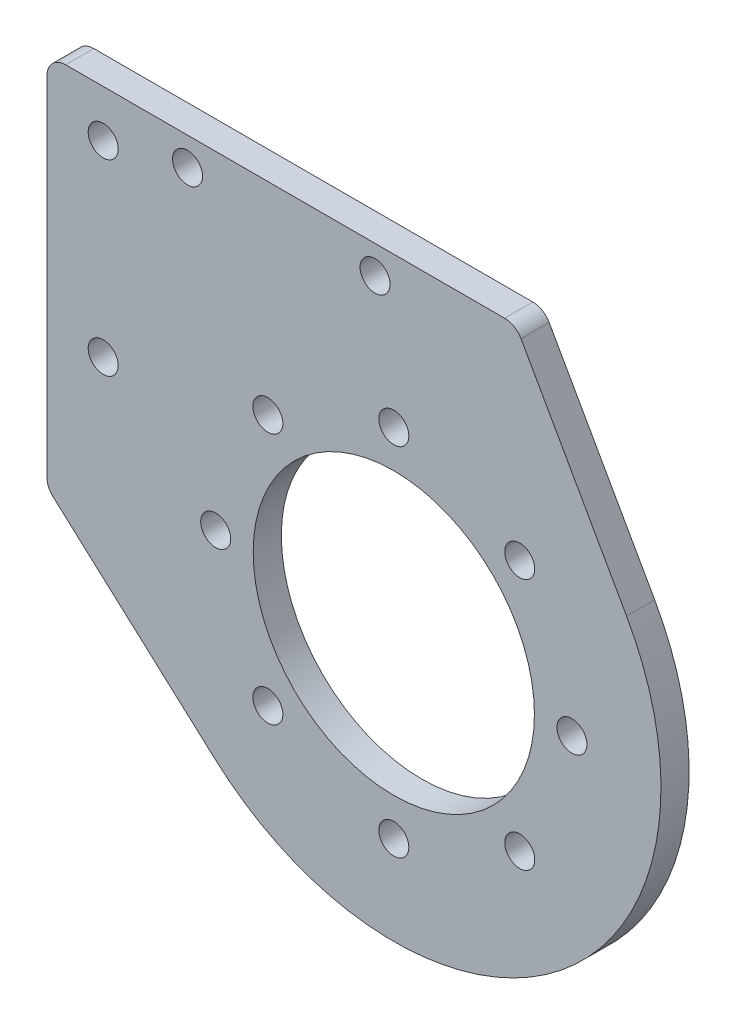
ISO-10303-21;
HEADER;
FILE_DESCRIPTION(('STEP AP214'),'2;1');
FILE_NAME('part.step','',(''),(''),'','','');
FILE_SCHEMA(('AUTOMOTIVE_DESIGN { 1 0 10303 214 1 1 1 1 }'));
ENDSEC;
DATA;
#1=APPLICATION_CONTEXT('core data for automotive mechanical design processes');
#2=APPLICATION_PROTOCOL_DEFINITION('international standard','automotive_design',2000,#1);
#3=PRODUCT_CONTEXT('',#1,'mechanical');
#4=PRODUCT('Part','Part','',(#3));
#5=PRODUCT_RELATED_PRODUCT_CATEGORY('part','',(#4));
#6=PRODUCT_DEFINITION_FORMATION('','',#4);
#7=PRODUCT_DEFINITION_CONTEXT('part definition',#1,'design');
#8=PRODUCT_DEFINITION('design','',#6,#7);
#9=PRODUCT_DEFINITION_SHAPE('','',#8);
#10=(LENGTH_UNIT() NAMED_UNIT(*) SI_UNIT(.MILLI.,.METRE.));
#11=(NAMED_UNIT(*) PLANE_ANGLE_UNIT() SI_UNIT($,.RADIAN.));
#12=(NAMED_UNIT(*) SI_UNIT($,.STERADIAN.) SOLID_ANGLE_UNIT());
#13=UNCERTAINTY_MEASURE_WITH_UNIT(LENGTH_MEASURE(1.E-05),#10,'distance_accuracy_value','');
#14=(GEOMETRIC_REPRESENTATION_CONTEXT(3) GLOBAL_UNCERTAINTY_ASSIGNED_CONTEXT((#13)) GLOBAL_UNIT_ASSIGNED_CONTEXT((#10,
#11,#12)) REPRESENTATION_CONTEXT('',''));
#15=CARTESIAN_POINT('',(0.,0.,0.));
#16=DIRECTION('',(0.,0.,1.));
#17=DIRECTION('',(1.,0.,0.));
#18=AXIS2_PLACEMENT_3D('',#15,#16,#17);
#19=CARTESIAN_POINT('',(0.,0.,3.));
#20=DIRECTION('',(0.,0.,-1.));
#21=DIRECTION('',(-1.,0.,0.));
#22=AXIS2_PLACEMENT_3D('',#19,#20,#21);
#23=CYLINDRICAL_SURFACE('',#22,28.5);
#24=DIRECTION('',(0.,0.,1.));
#25=VECTOR('',#24,1.);
#26=CARTESIAN_POINT('',(24.833892004956,13.9831258267306,-83.5298276579073));
#27=LINE('',#26,#25);
#28=CARTESIAN_POINT('',(24.833892004956,13.9831258267306,0.));
#29=VERTEX_POINT('',#28);
#30=CARTESIAN_POINT('',(24.833892004956,13.9831258267306,3.));
#31=VERTEX_POINT('',#30);
#32=EDGE_CURVE('E110',#29,#31,#27,.T.);
#33=ORIENTED_EDGE('',*,*,#32,.T.);
#34=CARTESIAN_POINT('',(0.,0.,3.));
#35=DIRECTION('',(0.,0.,1.));
#36=DIRECTION('',(1.,0.,0.));
#37=AXIS2_PLACEMENT_3D('',#34,#35,#36);
#38=CIRCLE('',#37,28.5);
#39=CARTESIAN_POINT('',(-19.0934161247275,-21.1587206770162,3.));
#40=VERTEX_POINT('',#39);
#41=EDGE_CURVE('E11',#40,#31,#38,.T.);
#42=ORIENTED_EDGE('',*,*,#41,.F.);
#43=DIRECTION('',(0.,0.,1.));
#44=VECTOR('',#43,1.);
#45=CARTESIAN_POINT('',(-19.0934161247275,-21.1587206770163,-83.5298276579073));
#46=LINE('',#45,#44);
#47=CARTESIAN_POINT('',(-19.0934161247275,-21.1587206770163,0.));
#48=VERTEX_POINT('',#47);
#49=EDGE_CURVE('E143',#48,#40,#46,.T.);
#50=ORIENTED_EDGE('',*,*,#49,.F.);
#51=CARTESIAN_POINT('',(0.,0.,0.));
#52=DIRECTION('',(0.,0.,1.));
#53=DIRECTION('',(1.,0.,0.));
#54=AXIS2_PLACEMENT_3D('',#51,#52,#53);
#55=CIRCLE('',#54,28.5);
#56=EDGE_CURVE('E42',#48,#29,#55,.T.);
#57=ORIENTED_EDGE('',*,*,#56,.T.);
#58=EDGE_LOOP('',(#33,#42,#50,#57));
#59=FACE_BOUND('',#58,.T.);
#60=ADVANCED_FACE('F39',(#59),#23,.T.);
#61=CARTESIAN_POINT('',(0.,0.,3.));
#62=DIRECTION('',(0.,0.,1.));
#63=DIRECTION('',(1.,0.,0.));
#64=AXIS2_PLACEMENT_3D('',#61,#62,#63);
#65=PLANE('',#64);
#66=CARTESIAN_POINT('',(-19.,1.96176408451265E-13,3.));
#67=DIRECTION('',(0.,0.,1.));
#68=DIRECTION('',(1.,0.,0.));
#69=AXIS2_PLACEMENT_3D('',#66,#67,#68);
#70=CIRCLE('',#69,1.6);
#71=CARTESIAN_POINT('',(-17.4,1.96176408451265E-13,3.));
#72=VERTEX_POINT('',#71);
#73=EDGE_CURVE('E169',#72,#72,#70,.T.);
#74=ORIENTED_EDGE('',*,*,#73,.F.);
#75=EDGE_LOOP('',(#74));
#76=FACE_BOUND('',#75,.T.);
#77=CARTESIAN_POINT('',(-1.30784272300843E-13,-19.,3.));
#78=DIRECTION('',(0.,0.,1.));
#79=DIRECTION('',(1.,0.,0.));
#80=AXIS2_PLACEMENT_3D('',#77,#78,#79);
#81=CIRCLE('',#80,1.6);
#82=CARTESIAN_POINT('',(1.59999999999987,-19.,3.));
#83=VERTEX_POINT('',#82);
#84=EDGE_CURVE('E181',#83,#83,#81,.T.);
#85=ORIENTED_EDGE('',*,*,#84,.F.);
#86=EDGE_LOOP('',(#85));
#87=FACE_BOUND('',#86,.T.);
#88=CARTESIAN_POINT('',(19.,-3.30686302041412E-13,3.));
#89=DIRECTION('',(0.,0.,1.));
#90=DIRECTION('',(1.,0.,0.));
#91=AXIS2_PLACEMENT_3D('',#88,#89,#90);
#92=CIRCLE('',#91,1.6);
#93=CARTESIAN_POINT('',(20.6,-3.30686302041412E-13,3.));
#94=VERTEX_POINT('',#93);
#95=EDGE_CURVE('E193',#94,#94,#92,.T.);
#96=ORIENTED_EDGE('',*,*,#95,.F.);
#97=EDGE_LOOP('',(#96));
#98=FACE_BOUND('',#97,.T.);
#99=CARTESIAN_POINT('',(0.,19.,3.));
#100=DIRECTION('',(0.,0.,1.));
#101=DIRECTION('',(1.,0.,0.));
#102=AXIS2_PLACEMENT_3D('',#99,#100,#101);
#103=CIRCLE('',#102,1.6);
#104=CARTESIAN_POINT('',(1.6,19.,3.));
#105=VERTEX_POINT('',#104);
#106=EDGE_CURVE('E205',#105,#105,#103,.T.);
#107=ORIENTED_EDGE('',*,*,#106,.F.);
#108=EDGE_LOOP('',(#107));
#109=FACE_BOUND('',#108,.T.);
#110=ORIENTED_EDGE('',*,*,#41,.T.);
#111=DIRECTION('',(-0.490635993920373,0.871364631752843,0.));
#112=VECTOR('',#111,1.);
#113=CARTESIAN_POINT('',(13.5736113362495,33.9812719878407,3.));
#114=LINE('',#113,#112);
#115=CARTESIAN_POINT('',(13.5736113362495,33.9812719878407,3.));
#116=VERTEX_POINT('',#115);
#117=EDGE_CURVE('E105',#31,#116,#114,.T.);
#118=ORIENTED_EDGE('',*,*,#117,.T.);
#119=CARTESIAN_POINT('',(11.8308820727438,33.,3.));
#120=DIRECTION('',(0.,0.,1.));
#121=DIRECTION('',(-1.,0.,0.));
#122=AXIS2_PLACEMENT_3D('',#119,#120,#121);
#123=CIRCLE('',#122,2.);
#124=CARTESIAN_POINT('',(11.8308820727438,35.,3.));
#125=VERTEX_POINT('',#124);
#126=EDGE_CURVE('E113',#116,#125,#123,.T.);
#127=ORIENTED_EDGE('',*,*,#126,.T.);
#128=DIRECTION('',(-1.,0.,0.));
#129=VECTOR('',#128,1.);
#130=CARTESIAN_POINT('',(-35.,35.,3.));
#131=LINE('',#130,#129);
#132=CARTESIAN_POINT('',(-35.,35.,3.));
#133=VERTEX_POINT('',#132);
#134=EDGE_CURVE('E119',#125,#133,#131,.T.);
#135=ORIENTED_EDGE('',*,*,#134,.T.);
#136=CARTESIAN_POINT('',(-35.,33.,3.));
#137=DIRECTION('',(0.,0.,1.));
#138=DIRECTION('',(-1.,0.,0.));
#139=AXIS2_PLACEMENT_3D('',#136,#137,#138);
#140=CIRCLE('',#139,2.);
#141=CARTESIAN_POINT('',(-37.,33.,3.));
#142=VERTEX_POINT('',#141);
#143=EDGE_CURVE('E132',#133,#142,#140,.T.);
#144=ORIENTED_EDGE('',*,*,#143,.T.);
#145=DIRECTION('',(0.,-1.,0.));
#146=VECTOR('',#145,1.);
#147=CARTESIAN_POINT('',(-37.,-4.11085513922489,3.));
#148=LINE('',#147,#146);
#149=CARTESIAN_POINT('',(-37.,-4.1108551392249,3.));
#150=VERTEX_POINT('',#149);
#151=EDGE_CURVE('E135',#142,#150,#148,.T.);
#152=ORIENTED_EDGE('',*,*,#151,.T.);
#153=CARTESIAN_POINT('',(-35.,-4.1108551392249,3.));
#154=DIRECTION('',(0.,0.,1.));
#155=DIRECTION('',(-1.,0.,0.));
#156=AXIS2_PLACEMENT_3D('',#153,#154,#155);
#157=CIRCLE('',#156,2.);
#158=CARTESIAN_POINT('',(-36.3398888508581,-5.59567764287517,3.));
#159=VERTEX_POINT('',#158);
#160=EDGE_CURVE('E138',#150,#159,#157,.T.);
#161=ORIENTED_EDGE('',*,*,#160,.T.);
#162=DIRECTION('',(0.742411251825131,-0.669944425429036,0.));
#163=VECTOR('',#162,1.);
#164=CARTESIAN_POINT('',(-36.3398888508581,-5.59567764287517,3.));
#165=LINE('',#164,#163);
#166=EDGE_CURVE('E141',#159,#40,#165,.T.);
#167=ORIENTED_EDGE('',*,*,#166,.T.);
#168=EDGE_LOOP('',(#110,#118,#127,#135,#144,#152,#161,#167));
#169=FACE_BOUND('',#168,.T.);
#170=CARTESIAN_POINT('',(0.,0.,3.));
#171=DIRECTION('',(0.,0.,1.));
#172=DIRECTION('',(1.,0.,0.));
#173=AXIS2_PLACEMENT_3D('',#170,#171,#172);
#174=CIRCLE('',#173,15.);
#175=CARTESIAN_POINT('',(15.,0.,3.));
#176=VERTEX_POINT('',#175);
#177=EDGE_CURVE('E211',#176,#176,#174,.T.);
#178=ORIENTED_EDGE('',*,*,#177,.F.);
#179=EDGE_LOOP('',(#178));
#180=FACE_BOUND('',#179,.T.);
#181=CARTESIAN_POINT('',(13.4350288425446,13.4350288425442,3.));
#182=DIRECTION('',(0.,0.,1.));
#183=DIRECTION('',(1.,0.,0.));
#184=AXIS2_PLACEMENT_3D('',#181,#182,#183);
#185=CIRCLE('',#184,1.6);
#186=CARTESIAN_POINT('',(15.0350288425446,13.4350288425442,3.));
#187=VERTEX_POINT('',#186);
#188=EDGE_CURVE('E199',#187,#187,#185,.T.);
#189=ORIENTED_EDGE('',*,*,#188,.F.);
#190=EDGE_LOOP('',(#189));
#191=FACE_BOUND('',#190,.T.);
#192=CARTESIAN_POINT('',(13.4350288425443,-13.4350288425445,3.));
#193=DIRECTION('',(0.,0.,1.));
#194=DIRECTION('',(1.,0.,0.));
#195=AXIS2_PLACEMENT_3D('',#192,#193,#194);
#196=CIRCLE('',#195,1.6);
#197=CARTESIAN_POINT('',(15.0350288425443,-13.4350288425445,3.));
#198=VERTEX_POINT('',#197);
#199=EDGE_CURVE('E187',#198,#198,#196,.T.);
#200=ORIENTED_EDGE('',*,*,#199,.F.);
#201=EDGE_LOOP('',(#200));
#202=FACE_BOUND('',#201,.T.);
#203=CARTESIAN_POINT('',(-13.4350288425445,-13.4350288425443,3.));
#204=DIRECTION('',(0.,0.,1.));
#205=DIRECTION('',(1.,0.,0.));
#206=AXIS2_PLACEMENT_3D('',#203,#204,#205);
#207=CIRCLE('',#206,1.6);
#208=CARTESIAN_POINT('',(-11.8350288425445,-13.4350288425443,3.));
#209=VERTEX_POINT('',#208);
#210=EDGE_CURVE('E175',#209,#209,#207,.T.);
#211=ORIENTED_EDGE('',*,*,#210,.F.);
#212=EDGE_LOOP('',(#211));
#213=FACE_BOUND('',#212,.T.);
#214=CARTESIAN_POINT('',(-13.4350288425442,13.4350288425446,3.));
#215=DIRECTION('',(0.,0.,1.));
#216=DIRECTION('',(1.,0.,0.));
#217=AXIS2_PLACEMENT_3D('',#214,#215,#216);
#218=CIRCLE('',#217,1.6);
#219=CARTESIAN_POINT('',(-11.8350288425442,13.4350288425446,3.));
#220=VERTEX_POINT('',#219);
#221=EDGE_CURVE('E161',#220,#220,#218,.T.);
#222=ORIENTED_EDGE('',*,*,#221,.F.);
#223=EDGE_LOOP('',(#222));
#224=FACE_BOUND('',#223,.T.);
#225=CARTESIAN_POINT('',(-2.,32.,3.));
#226=DIRECTION('',(0.,0.,1.));
#227=DIRECTION('',(1.,0.,0.));
#228=AXIS2_PLACEMENT_3D('',#225,#226,#227);
#229=CIRCLE('',#228,1.6);
#230=CARTESIAN_POINT('',(-0.400000000000003,32.,3.));
#231=VERTEX_POINT('',#230);
#232=EDGE_CURVE('E293',#231,#231,#229,.T.);
#233=ORIENTED_EDGE('',*,*,#232,.F.);
#234=EDGE_LOOP('',(#233));
#235=FACE_BOUND('',#234,.T.);
#236=CARTESIAN_POINT('',(-22.,32.,3.));
#237=DIRECTION('',(0.,0.,1.));
#238=DIRECTION('',(1.,0.,0.));
#239=AXIS2_PLACEMENT_3D('',#236,#237,#238);
#240=CIRCLE('',#239,1.6);
#241=CARTESIAN_POINT('',(-20.4,32.,3.));
#242=VERTEX_POINT('',#241);
#243=EDGE_CURVE('E296',#242,#242,#240,.T.);
#244=ORIENTED_EDGE('',*,*,#243,.F.);
#245=EDGE_LOOP('',(#244));
#246=FACE_BOUND('',#245,.T.);
#247=CARTESIAN_POINT('',(-31.,10.,3.));
#248=DIRECTION('',(0.,0.,1.));
#249=DIRECTION('',(1.,0.,0.));
#250=AXIS2_PLACEMENT_3D('',#247,#248,#249);
#251=CIRCLE('',#250,1.6);
#252=CARTESIAN_POINT('',(-29.4,10.,3.));
#253=VERTEX_POINT('',#252);
#254=EDGE_CURVE('E127',#253,#253,#251,.T.);
#255=ORIENTED_EDGE('',*,*,#254,.F.);
#256=EDGE_LOOP('',(#255));
#257=FACE_BOUND('',#256,.T.);
#258=CARTESIAN_POINT('',(-31.,30.,3.));
#259=DIRECTION('',(0.,0.,1.));
#260=DIRECTION('',(1.,0.,0.));
#261=AXIS2_PLACEMENT_3D('',#258,#259,#260);
#262=CIRCLE('',#261,1.6);
#263=CARTESIAN_POINT('',(-29.4,30.,3.));
#264=VERTEX_POINT('',#263);
#265=EDGE_CURVE('E124',#264,#264,#262,.T.);
#266=ORIENTED_EDGE('',*,*,#265,.F.);
#267=EDGE_LOOP('',(#266));
#268=FACE_BOUND('',#267,.T.);
#269=ADVANCED_FACE('F121',(#76,#87,#98,#109,#169,#180,#191,#202,#213,#224,#235,#246,#257,#268),
#65,.T.);
#270=CARTESIAN_POINT('',(0.,0.,0.));
#271=DIRECTION('',(0.,0.,1.));
#272=DIRECTION('',(1.,0.,0.));
#273=AXIS2_PLACEMENT_3D('',#270,#271,#272);
#274=PLANE('',#273);
#275=ORIENTED_EDGE('',*,*,#56,.F.);
#276=DIRECTION('',(-0.742411251825131,0.669944425429036,0.));
#277=VECTOR('',#276,1.);
#278=CARTESIAN_POINT('',(-36.3398888508581,-5.59567764287517,0.));
#279=LINE('',#278,#277);
#280=CARTESIAN_POINT('',(-36.3398888508581,-5.59567764287517,0.));
#281=VERTEX_POINT('',#280);
#282=EDGE_CURVE('E282',#48,#281,#279,.T.);
#283=ORIENTED_EDGE('',*,*,#282,.T.);
#284=CARTESIAN_POINT('',(-35.,-4.1108551392249,0.));
#285=DIRECTION('',(0.,0.,1.));
#286=DIRECTION('',(1.,0.,0.));
#287=AXIS2_PLACEMENT_3D('',#284,#285,#286);
#288=CIRCLE('',#287,2.);
#289=CARTESIAN_POINT('',(-37.,-4.1108551392249,0.));
#290=VERTEX_POINT('',#289);
#291=EDGE_CURVE('E290',#281,#290,#288,.F.);
#292=ORIENTED_EDGE('',*,*,#291,.T.);
#293=DIRECTION('',(0.,1.,0.));
#294=VECTOR('',#293,1.);
#295=CARTESIAN_POINT('',(-37.,-4.11085513922489,0.));
#296=LINE('',#295,#294);
#297=CARTESIAN_POINT('',(-37.,33.,0.));
#298=VERTEX_POINT('',#297);
#299=EDGE_CURVE('E288',#290,#298,#296,.T.);
#300=ORIENTED_EDGE('',*,*,#299,.T.);
#301=CARTESIAN_POINT('',(-35.,33.,0.));
#302=DIRECTION('',(0.,0.,1.));
#303=DIRECTION('',(1.,0.,0.));
#304=AXIS2_PLACEMENT_3D('',#301,#302,#303);
#305=CIRCLE('',#304,2.);
#306=CARTESIAN_POINT('',(-35.,35.,0.));
#307=VERTEX_POINT('',#306);
#308=EDGE_CURVE('E286',#298,#307,#305,.F.);
#309=ORIENTED_EDGE('',*,*,#308,.T.);
#310=DIRECTION('',(1.,0.,0.));
#311=VECTOR('',#310,1.);
#312=CARTESIAN_POINT('',(-35.,35.,0.));
#313=LINE('',#312,#311);
#314=CARTESIAN_POINT('',(11.8308820727438,35.,0.));
#315=VERTEX_POINT('',#314);
#316=EDGE_CURVE('E284',#307,#315,#313,.T.);
#317=ORIENTED_EDGE('',*,*,#316,.T.);
#318=CARTESIAN_POINT('',(11.8308820727438,33.,0.));
#319=DIRECTION('',(0.,0.,1.));
#320=DIRECTION('',(1.,0.,0.));
#321=AXIS2_PLACEMENT_3D('',#318,#319,#320);
#322=CIRCLE('',#321,2.);
#323=CARTESIAN_POINT('',(13.5736113362495,33.9812719878407,0.));
#324=VERTEX_POINT('',#323);
#325=EDGE_CURVE('E145',#315,#324,#322,.F.);
#326=ORIENTED_EDGE('',*,*,#325,.T.);
#327=DIRECTION('',(0.490635993920373,-0.871364631752843,0.));
#328=VECTOR('',#327,1.);
#329=CARTESIAN_POINT('',(13.5736113362495,33.9812719878407,0.));
#330=LINE('',#329,#328);
#331=EDGE_CURVE('E106',#324,#29,#330,.T.);
#332=ORIENTED_EDGE('',*,*,#331,.T.);
#333=EDGE_LOOP('',(#275,#283,#292,#300,#309,#317,#326,#332));
#334=FACE_BOUND('',#333,.T.);
#335=CARTESIAN_POINT('',(0.,0.,0.));
#336=DIRECTION('',(0.,0.,1.));
#337=DIRECTION('',(1.,0.,0.));
#338=AXIS2_PLACEMENT_3D('',#335,#336,#337);
#339=CIRCLE('',#338,15.);
#340=CARTESIAN_POINT('',(15.,0.,0.));
#341=VERTEX_POINT('',#340);
#342=EDGE_CURVE('E208',#341,#341,#339,.T.);
#343=ORIENTED_EDGE('',*,*,#342,.T.);
#344=EDGE_LOOP('',(#343));
#345=FACE_BOUND('',#344,.T.);
#346=CARTESIAN_POINT('',(0.,19.,0.));
#347=DIRECTION('',(0.,0.,1.));
#348=DIRECTION('',(1.,0.,0.));
#349=AXIS2_PLACEMENT_3D('',#346,#347,#348);
#350=CIRCLE('',#349,1.6);
#351=CARTESIAN_POINT('',(1.6,19.,0.));
#352=VERTEX_POINT('',#351);
#353=EDGE_CURVE('E202',#352,#352,#350,.T.);
#354=ORIENTED_EDGE('',*,*,#353,.T.);
#355=EDGE_LOOP('',(#354));
#356=FACE_BOUND('',#355,.T.);
#357=CARTESIAN_POINT('',(13.4350288425446,13.4350288425442,0.));
#358=DIRECTION('',(0.,0.,1.));
#359=DIRECTION('',(1.,0.,0.));
#360=AXIS2_PLACEMENT_3D('',#357,#358,#359);
#361=CIRCLE('',#360,1.6);
#362=CARTESIAN_POINT('',(15.0350288425446,13.4350288425442,0.));
#363=VERTEX_POINT('',#362);
#364=EDGE_CURVE('E196',#363,#363,#361,.T.);
#365=ORIENTED_EDGE('',*,*,#364,.T.);
#366=EDGE_LOOP('',(#365));
#367=FACE_BOUND('',#366,.T.);
#368=CARTESIAN_POINT('',(19.,-3.30686302041412E-13,0.));
#369=DIRECTION('',(0.,0.,1.));
#370=DIRECTION('',(1.,0.,0.));
#371=AXIS2_PLACEMENT_3D('',#368,#369,#370);
#372=CIRCLE('',#371,1.6);
#373=CARTESIAN_POINT('',(20.6,-3.30686302041412E-13,0.));
#374=VERTEX_POINT('',#373);
#375=EDGE_CURVE('E190',#374,#374,#372,.T.);
#376=ORIENTED_EDGE('',*,*,#375,.T.);
#377=EDGE_LOOP('',(#376));
#378=FACE_BOUND('',#377,.T.);
#379=CARTESIAN_POINT('',(13.4350288425443,-13.4350288425445,0.));
#380=DIRECTION('',(0.,0.,1.));
#381=DIRECTION('',(1.,0.,0.));
#382=AXIS2_PLACEMENT_3D('',#379,#380,#381);
#383=CIRCLE('',#382,1.6);
#384=CARTESIAN_POINT('',(15.0350288425443,-13.4350288425445,0.));
#385=VERTEX_POINT('',#384);
#386=EDGE_CURVE('E184',#385,#385,#383,.T.);
#387=ORIENTED_EDGE('',*,*,#386,.T.);
#388=EDGE_LOOP('',(#387));
#389=FACE_BOUND('',#388,.T.);
#390=CARTESIAN_POINT('',(-1.30784272300843E-13,-19.,0.));
#391=DIRECTION('',(0.,0.,1.));
#392=DIRECTION('',(1.,0.,0.));
#393=AXIS2_PLACEMENT_3D('',#390,#391,#392);
#394=CIRCLE('',#393,1.6);
#395=CARTESIAN_POINT('',(1.59999999999987,-19.,0.));
#396=VERTEX_POINT('',#395);
#397=EDGE_CURVE('E178',#396,#396,#394,.T.);
#398=ORIENTED_EDGE('',*,*,#397,.T.);
#399=EDGE_LOOP('',(#398));
#400=FACE_BOUND('',#399,.T.);
#401=CARTESIAN_POINT('',(-13.4350288425445,-13.4350288425443,0.));
#402=DIRECTION('',(0.,0.,1.));
#403=DIRECTION('',(1.,0.,0.));
#404=AXIS2_PLACEMENT_3D('',#401,#402,#403);
#405=CIRCLE('',#404,1.6);
#406=CARTESIAN_POINT('',(-11.8350288425445,-13.4350288425443,0.));
#407=VERTEX_POINT('',#406);
#408=EDGE_CURVE('E172',#407,#407,#405,.T.);
#409=ORIENTED_EDGE('',*,*,#408,.T.);
#410=EDGE_LOOP('',(#409));
#411=FACE_BOUND('',#410,.T.);
#412=CARTESIAN_POINT('',(-19.,1.96176408451265E-13,0.));
#413=DIRECTION('',(0.,0.,1.));
#414=DIRECTION('',(1.,0.,0.));
#415=AXIS2_PLACEMENT_3D('',#412,#413,#414);
#416=CIRCLE('',#415,1.6);
#417=CARTESIAN_POINT('',(-17.4,1.96176408451265E-13,0.));
#418=VERTEX_POINT('',#417);
#419=EDGE_CURVE('E164',#418,#418,#416,.T.);
#420=ORIENTED_EDGE('',*,*,#419,.T.);
#421=EDGE_LOOP('',(#420));
#422=FACE_BOUND('',#421,.T.);
#423=CARTESIAN_POINT('',(-13.4350288425442,13.4350288425446,0.));
#424=DIRECTION('',(0.,0.,1.));
#425=DIRECTION('',(1.,0.,0.));
#426=AXIS2_PLACEMENT_3D('',#423,#424,#425);
#427=CIRCLE('',#426,1.6);
#428=CARTESIAN_POINT('',(-11.8350288425442,13.4350288425446,0.));
#429=VERTEX_POINT('',#428);
#430=EDGE_CURVE('E165',#429,#429,#427,.T.);
#431=ORIENTED_EDGE('',*,*,#430,.T.);
#432=EDGE_LOOP('',(#431));
#433=FACE_BOUND('',#432,.T.);
#434=CARTESIAN_POINT('',(-31.,10.,0.));
#435=DIRECTION('',(0.,0.,1.));
#436=DIRECTION('',(1.,0.,0.));
#437=AXIS2_PLACEMENT_3D('',#434,#435,#436);
#438=CIRCLE('',#437,1.6);
#439=CARTESIAN_POINT('',(-29.4,10.,0.));
#440=VERTEX_POINT('',#439);
#441=EDGE_CURVE('E160',#440,#440,#438,.F.);
#442=ORIENTED_EDGE('',*,*,#441,.F.);
#443=EDGE_LOOP('',(#442));
#444=FACE_BOUND('',#443,.T.);
#445=CARTESIAN_POINT('',(-2.,32.,0.));
#446=DIRECTION('',(0.,0.,1.));
#447=DIRECTION('',(1.,0.,0.));
#448=AXIS2_PLACEMENT_3D('',#445,#446,#447);
#449=CIRCLE('',#448,1.6);
#450=CARTESIAN_POINT('',(-0.400000000000003,32.,0.));
#451=VERTEX_POINT('',#450);
#452=EDGE_CURVE('E156',#451,#451,#449,.F.);
#453=ORIENTED_EDGE('',*,*,#452,.F.);
#454=EDGE_LOOP('',(#453));
#455=FACE_BOUND('',#454,.T.);
#456=CARTESIAN_POINT('',(-22.,32.,0.));
#457=DIRECTION('',(0.,0.,1.));
#458=DIRECTION('',(1.,0.,0.));
#459=AXIS2_PLACEMENT_3D('',#456,#457,#458);
#460=CIRCLE('',#459,1.6);
#461=CARTESIAN_POINT('',(-20.4,32.,0.));
#462=VERTEX_POINT('',#461);
#463=EDGE_CURVE('E159',#462,#462,#460,.F.);
#464=ORIENTED_EDGE('',*,*,#463,.F.);
#465=EDGE_LOOP('',(#464));
#466=FACE_BOUND('',#465,.T.);
#467=CARTESIAN_POINT('',(-31.,30.,0.));
#468=DIRECTION('',(0.,0.,1.));
#469=DIRECTION('',(1.,0.,0.));
#470=AXIS2_PLACEMENT_3D('',#467,#468,#469);
#471=CIRCLE('',#470,1.6);
#472=CARTESIAN_POINT('',(-29.4,30.,0.));
#473=VERTEX_POINT('',#472);
#474=EDGE_CURVE('E168',#473,#473,#471,.F.);
#475=ORIENTED_EDGE('',*,*,#474,.F.);
#476=EDGE_LOOP('',(#475));
#477=FACE_BOUND('',#476,.T.);
#478=ADVANCED_FACE('F217',(#334,#345,#356,#367,#378,#389,#400,#411,#422,#433,#444,#455,#466,
#477),#274,.F.);
#479=CARTESIAN_POINT('',(0.,0.,3.));
#480=DIRECTION('',(0.,0.,-1.));
#481=DIRECTION('',(-1.,0.,0.));
#482=AXIS2_PLACEMENT_3D('',#479,#480,#481);
#483=CYLINDRICAL_SURFACE('',#482,15.);
#484=ORIENTED_EDGE('',*,*,#177,.T.);
#485=EDGE_LOOP('',(#484));
#486=FACE_BOUND('',#485,.T.);
#487=ORIENTED_EDGE('',*,*,#342,.F.);
#488=EDGE_LOOP('',(#487));
#489=FACE_BOUND('',#488,.T.);
#490=ADVANCED_FACE('F220',(#486,#489),#483,.F.);
#491=CARTESIAN_POINT('',(0.,19.,3.));
#492=DIRECTION('',(0.,0.,-1.));
#493=DIRECTION('',(-1.,0.,0.));
#494=AXIS2_PLACEMENT_3D('',#491,#492,#493);
#495=CYLINDRICAL_SURFACE('',#494,1.6);
#496=ORIENTED_EDGE('',*,*,#106,.T.);
#497=EDGE_LOOP('',(#496));
#498=FACE_BOUND('',#497,.T.);
#499=ORIENTED_EDGE('',*,*,#353,.F.);
#500=EDGE_LOOP('',(#499));
#501=FACE_BOUND('',#500,.T.);
#502=ADVANCED_FACE('F222',(#498,#501),#495,.F.);
#503=CARTESIAN_POINT('',(13.4350288425446,13.4350288425442,3.));
#504=DIRECTION('',(0.,0.,-1.));
#505=DIRECTION('',(-1.,0.,0.));
#506=AXIS2_PLACEMENT_3D('',#503,#504,#505);
#507=CYLINDRICAL_SURFACE('',#506,1.6);
#508=ORIENTED_EDGE('',*,*,#188,.T.);
#509=EDGE_LOOP('',(#508));
#510=FACE_BOUND('',#509,.T.);
#511=ORIENTED_EDGE('',*,*,#364,.F.);
#512=EDGE_LOOP('',(#511));
#513=FACE_BOUND('',#512,.T.);
#514=ADVANCED_FACE('F228',(#510,#513),#507,.F.);
#515=CARTESIAN_POINT('',(19.,-3.30686302041412E-13,3.));
#516=DIRECTION('',(0.,0.,-1.));
#517=DIRECTION('',(-1.,0.,0.));
#518=AXIS2_PLACEMENT_3D('',#515,#516,#517);
#519=CYLINDRICAL_SURFACE('',#518,1.6);
#520=ORIENTED_EDGE('',*,*,#95,.T.);
#521=EDGE_LOOP('',(#520));
#522=FACE_BOUND('',#521,.T.);
#523=ORIENTED_EDGE('',*,*,#375,.F.);
#524=EDGE_LOOP('',(#523));
#525=FACE_BOUND('',#524,.T.);
#526=ADVANCED_FACE('F359',(#522,#525),#519,.F.);
#527=CARTESIAN_POINT('',(13.4350288425443,-13.4350288425445,3.));
#528=DIRECTION('',(0.,0.,-1.));
#529=DIRECTION('',(-1.,0.,0.));
#530=AXIS2_PLACEMENT_3D('',#527,#528,#529);
#531=CYLINDRICAL_SURFACE('',#530,1.6);
#532=ORIENTED_EDGE('',*,*,#199,.T.);
#533=EDGE_LOOP('',(#532));
#534=FACE_BOUND('',#533,.T.);
#535=ORIENTED_EDGE('',*,*,#386,.F.);
#536=EDGE_LOOP('',(#535));
#537=FACE_BOUND('',#536,.T.);
#538=ADVANCED_FACE('F355',(#534,#537),#531,.F.);
#539=CARTESIAN_POINT('',(-1.30784272300843E-13,-19.,3.));
#540=DIRECTION('',(0.,0.,-1.));
#541=DIRECTION('',(-1.,0.,0.));
#542=AXIS2_PLACEMENT_3D('',#539,#540,#541);
#543=CYLINDRICAL_SURFACE('',#542,1.6);
#544=ORIENTED_EDGE('',*,*,#84,.T.);
#545=EDGE_LOOP('',(#544));
#546=FACE_BOUND('',#545,.T.);
#547=ORIENTED_EDGE('',*,*,#397,.F.);
#548=EDGE_LOOP('',(#547));
#549=FACE_BOUND('',#548,.T.);
#550=ADVANCED_FACE('F351',(#546,#549),#543,.F.);
#551=CARTESIAN_POINT('',(-13.4350288425445,-13.4350288425443,3.));
#552=DIRECTION('',(0.,0.,-1.));
#553=DIRECTION('',(-1.,0.,0.));
#554=AXIS2_PLACEMENT_3D('',#551,#552,#553);
#555=CYLINDRICAL_SURFACE('',#554,1.6);
#556=ORIENTED_EDGE('',*,*,#210,.T.);
#557=EDGE_LOOP('',(#556));
#558=FACE_BOUND('',#557,.T.);
#559=ORIENTED_EDGE('',*,*,#408,.F.);
#560=EDGE_LOOP('',(#559));
#561=FACE_BOUND('',#560,.T.);
#562=ADVANCED_FACE('F347',(#558,#561),#555,.F.);
#563=CARTESIAN_POINT('',(-19.,1.96176408451265E-13,3.));
#564=DIRECTION('',(0.,0.,-1.));
#565=DIRECTION('',(-1.,0.,0.));
#566=AXIS2_PLACEMENT_3D('',#563,#564,#565);
#567=CYLINDRICAL_SURFACE('',#566,1.6);
#568=ORIENTED_EDGE('',*,*,#73,.T.);
#569=EDGE_LOOP('',(#568));
#570=FACE_BOUND('',#569,.T.);
#571=ORIENTED_EDGE('',*,*,#419,.F.);
#572=EDGE_LOOP('',(#571));
#573=FACE_BOUND('',#572,.T.);
#574=ADVANCED_FACE('F343',(#570,#573),#567,.F.);
#575=CARTESIAN_POINT('',(-13.4350288425442,13.4350288425446,3.));
#576=DIRECTION('',(0.,0.,-1.));
#577=DIRECTION('',(-1.,0.,0.));
#578=AXIS2_PLACEMENT_3D('',#575,#576,#577);
#579=CYLINDRICAL_SURFACE('',#578,1.6);
#580=ORIENTED_EDGE('',*,*,#221,.T.);
#581=EDGE_LOOP('',(#580));
#582=FACE_BOUND('',#581,.T.);
#583=ORIENTED_EDGE('',*,*,#430,.F.);
#584=EDGE_LOOP('',(#583));
#585=FACE_BOUND('',#584,.T.);
#586=ADVANCED_FACE('F341',(#582,#585),#579,.F.);
#587=CARTESIAN_POINT('',(13.5736113362495,33.9812719878407,-83.5298276579073));
#588=DIRECTION('',(0.871364631752843,0.490635993920373,0.));
#589=DIRECTION('',(-0.490635993920373,0.871364631752843,0.));
#590=AXIS2_PLACEMENT_3D('',#587,#588,#589);
#591=PLANE('',#590);
#592=ORIENTED_EDGE('',*,*,#331,.F.);
#593=DIRECTION('',(0.,0.,1.));
#594=VECTOR('',#593,1.);
#595=CARTESIAN_POINT('',(13.5736113362495,33.9812719878407,-83.5298276579073));
#596=LINE('',#595,#594);
#597=EDGE_CURVE('E100',#324,#116,#596,.T.);
#598=ORIENTED_EDGE('',*,*,#597,.T.);
#599=ORIENTED_EDGE('',*,*,#117,.F.);
#600=ORIENTED_EDGE('',*,*,#32,.F.);
#601=EDGE_LOOP('',(#592,#598,#599,#600));
#602=FACE_BOUND('',#601,.T.);
#603=ADVANCED_FACE('F102',(#602),#591,.T.);
#604=CARTESIAN_POINT('',(11.8308820727438,33.,-83.5298276579073));
#605=DIRECTION('',(0.,0.,1.));
#606=DIRECTION('',(1.,0.,0.));
#607=AXIS2_PLACEMENT_3D('',#604,#605,#606);
#608=CYLINDRICAL_SURFACE('',#607,2.);
#609=ORIENTED_EDGE('',*,*,#325,.F.);
#610=DIRECTION('',(0.,0.,1.));
#611=VECTOR('',#610,1.);
#612=CARTESIAN_POINT('',(11.8308820727438,35.,-83.5298276579073));
#613=LINE('',#612,#611);
#614=EDGE_CURVE('E109',#315,#125,#613,.T.);
#615=ORIENTED_EDGE('',*,*,#614,.T.);
#616=ORIENTED_EDGE('',*,*,#126,.F.);
#617=ORIENTED_EDGE('',*,*,#597,.F.);
#618=EDGE_LOOP('',(#609,#615,#616,#617));
#619=FACE_BOUND('',#618,.T.);
#620=ADVANCED_FACE('F114',(#619),#608,.T.);
#621=CARTESIAN_POINT('',(-35.,35.,-83.5298276579073));
#622=DIRECTION('',(0.,1.,0.));
#623=DIRECTION('',(0.,0.,1.));
#624=AXIS2_PLACEMENT_3D('',#621,#622,#623);
#625=PLANE('',#624);
#626=ORIENTED_EDGE('',*,*,#316,.F.);
#627=DIRECTION('',(0.,0.,1.));
#628=VECTOR('',#627,1.);
#629=CARTESIAN_POINT('',(-35.,35.,-83.5298276579073));
#630=LINE('',#629,#628);
#631=EDGE_CURVE('E152',#307,#133,#630,.T.);
#632=ORIENTED_EDGE('',*,*,#631,.T.);
#633=ORIENTED_EDGE('',*,*,#134,.F.);
#634=ORIENTED_EDGE('',*,*,#614,.F.);
#635=EDGE_LOOP('',(#626,#632,#633,#634));
#636=FACE_BOUND('',#635,.T.);
#637=ADVANCED_FACE('F332',(#636),#625,.T.);
#638=CARTESIAN_POINT('',(-35.,33.,-83.5298276579073));
#639=DIRECTION('',(0.,0.,1.));
#640=DIRECTION('',(1.,0.,0.));
#641=AXIS2_PLACEMENT_3D('',#638,#639,#640);
#642=CYLINDRICAL_SURFACE('',#641,2.);
#643=ORIENTED_EDGE('',*,*,#308,.F.);
#644=DIRECTION('',(0.,0.,1.));
#645=VECTOR('',#644,1.);
#646=CARTESIAN_POINT('',(-37.,33.,-83.5298276579073));
#647=LINE('',#646,#645);
#648=EDGE_CURVE('E150',#298,#142,#647,.T.);
#649=ORIENTED_EDGE('',*,*,#648,.T.);
#650=ORIENTED_EDGE('',*,*,#143,.F.);
#651=ORIENTED_EDGE('',*,*,#631,.F.);
#652=EDGE_LOOP('',(#643,#649,#650,#651));
#653=FACE_BOUND('',#652,.T.);
#654=ADVANCED_FACE('F328',(#653),#642,.T.);
#655=CARTESIAN_POINT('',(-37.,-4.11085513922489,-83.5298276579073));
#656=DIRECTION('',(-1.,0.,0.));
#657=DIRECTION('',(0.,0.,1.));
#658=AXIS2_PLACEMENT_3D('',#655,#656,#657);
#659=PLANE('',#658);
#660=ORIENTED_EDGE('',*,*,#299,.F.);
#661=DIRECTION('',(0.,0.,1.));
#662=VECTOR('',#661,1.);
#663=CARTESIAN_POINT('',(-37.,-4.1108551392249,-83.5298276579073));
#664=LINE('',#663,#662);
#665=EDGE_CURVE('E148',#290,#150,#664,.T.);
#666=ORIENTED_EDGE('',*,*,#665,.T.);
#667=ORIENTED_EDGE('',*,*,#151,.F.);
#668=ORIENTED_EDGE('',*,*,#648,.F.);
#669=EDGE_LOOP('',(#660,#666,#667,#668));
#670=FACE_BOUND('',#669,.T.);
#671=ADVANCED_FACE('F324',(#670),#659,.T.);
#672=CARTESIAN_POINT('',(-35.,-4.1108551392249,-83.5298276579073));
#673=DIRECTION('',(0.,0.,1.));
#674=DIRECTION('',(1.,0.,0.));
#675=AXIS2_PLACEMENT_3D('',#672,#673,#674);
#676=CYLINDRICAL_SURFACE('',#675,2.);
#677=ORIENTED_EDGE('',*,*,#291,.F.);
#678=DIRECTION('',(0.,0.,1.));
#679=VECTOR('',#678,1.);
#680=CARTESIAN_POINT('',(-36.3398888508581,-5.59567764287517,-83.5298276579073));
#681=LINE('',#680,#679);
#682=EDGE_CURVE('E146',#281,#159,#681,.T.);
#683=ORIENTED_EDGE('',*,*,#682,.T.);
#684=ORIENTED_EDGE('',*,*,#160,.F.);
#685=ORIENTED_EDGE('',*,*,#665,.F.);
#686=EDGE_LOOP('',(#677,#683,#684,#685));
#687=FACE_BOUND('',#686,.T.);
#688=ADVANCED_FACE('F317',(#687),#676,.T.);
#689=CARTESIAN_POINT('',(-36.3398888508581,-5.59567764287517,-83.5298276579073));
#690=DIRECTION('',(-0.669944425429036,-0.742411251825131,0.));
#691=DIRECTION('',(0.742411251825131,-0.669944425429036,0.));
#692=AXIS2_PLACEMENT_3D('',#689,#690,#691);
#693=PLANE('',#692);
#694=ORIENTED_EDGE('',*,*,#282,.F.);
#695=ORIENTED_EDGE('',*,*,#49,.T.);
#696=ORIENTED_EDGE('',*,*,#166,.F.);
#697=ORIENTED_EDGE('',*,*,#682,.F.);
#698=EDGE_LOOP('',(#694,#695,#696,#697));
#699=FACE_BOUND('',#698,.T.);
#700=ADVANCED_FACE('F308',(#699),#693,.T.);
#701=CARTESIAN_POINT('',(-31.,30.,-83.5298276579073));
#702=DIRECTION('',(0.,0.,1.));
#703=DIRECTION('',(1.,0.,0.));
#704=AXIS2_PLACEMENT_3D('',#701,#702,#703);
#705=CYLINDRICAL_SURFACE('',#704,1.6);
#706=ORIENTED_EDGE('',*,*,#474,.T.);
#707=EDGE_LOOP('',(#706));
#708=FACE_BOUND('',#707,.T.);
#709=ORIENTED_EDGE('',*,*,#265,.T.);
#710=EDGE_LOOP('',(#709));
#711=FACE_BOUND('',#710,.T.);
#712=ADVANCED_FACE('F306',(#708,#711),#705,.F.);
#713=CARTESIAN_POINT('',(-31.,10.,-83.5298276579073));
#714=DIRECTION('',(0.,0.,1.));
#715=DIRECTION('',(1.,0.,0.));
#716=AXIS2_PLACEMENT_3D('',#713,#714,#715);
#717=CYLINDRICAL_SURFACE('',#716,1.6);
#718=ORIENTED_EDGE('',*,*,#441,.T.);
#719=EDGE_LOOP('',(#718));
#720=FACE_BOUND('',#719,.T.);
#721=ORIENTED_EDGE('',*,*,#254,.T.);
#722=EDGE_LOOP('',(#721));
#723=FACE_BOUND('',#722,.T.);
#724=ADVANCED_FACE('F301',(#720,#723),#717,.F.);
#725=CARTESIAN_POINT('',(-22.,32.,-83.5298276579073));
#726=DIRECTION('',(0.,0.,1.));
#727=DIRECTION('',(1.,0.,0.));
#728=AXIS2_PLACEMENT_3D('',#725,#726,#727);
#729=CYLINDRICAL_SURFACE('',#728,1.6);
#730=ORIENTED_EDGE('',*,*,#463,.T.);
#731=EDGE_LOOP('',(#730));
#732=FACE_BOUND('',#731,.T.);
#733=ORIENTED_EDGE('',*,*,#243,.T.);
#734=EDGE_LOOP('',(#733));
#735=FACE_BOUND('',#734,.T.);
#736=ADVANCED_FACE('F314',(#732,#735),#729,.F.);
#737=CARTESIAN_POINT('',(-2.,32.,-83.5298276579073));
#738=DIRECTION('',(0.,0.,1.));
#739=DIRECTION('',(1.,0.,0.));
#740=AXIS2_PLACEMENT_3D('',#737,#738,#739);
#741=CYLINDRICAL_SURFACE('',#740,1.6);
#742=ORIENTED_EDGE('',*,*,#452,.T.);
#743=EDGE_LOOP('',(#742));
#744=FACE_BOUND('',#743,.T.);
#745=ORIENTED_EDGE('',*,*,#232,.T.);
#746=EDGE_LOOP('',(#745));
#747=FACE_BOUND('',#746,.T.);
#748=ADVANCED_FACE('F383',(#744,#747),#741,.F.);
#749=CLOSED_SHELL('',(#60,#269,#478,#490,#502,#514,#526,#538,#550,#562,#574,#586,#603,#620,#637,
#654,#671,#688,#700,#712,#724,#736,#748));
#750=MANIFOLD_SOLID_BREP('B2',#749);
#751=ADVANCED_BREP_SHAPE_REPRESENTATION('',(#18,#750),#14);
#752=SHAPE_DEFINITION_REPRESENTATION(#9,#751);
ENDSEC;
END-ISO-10303-21;
